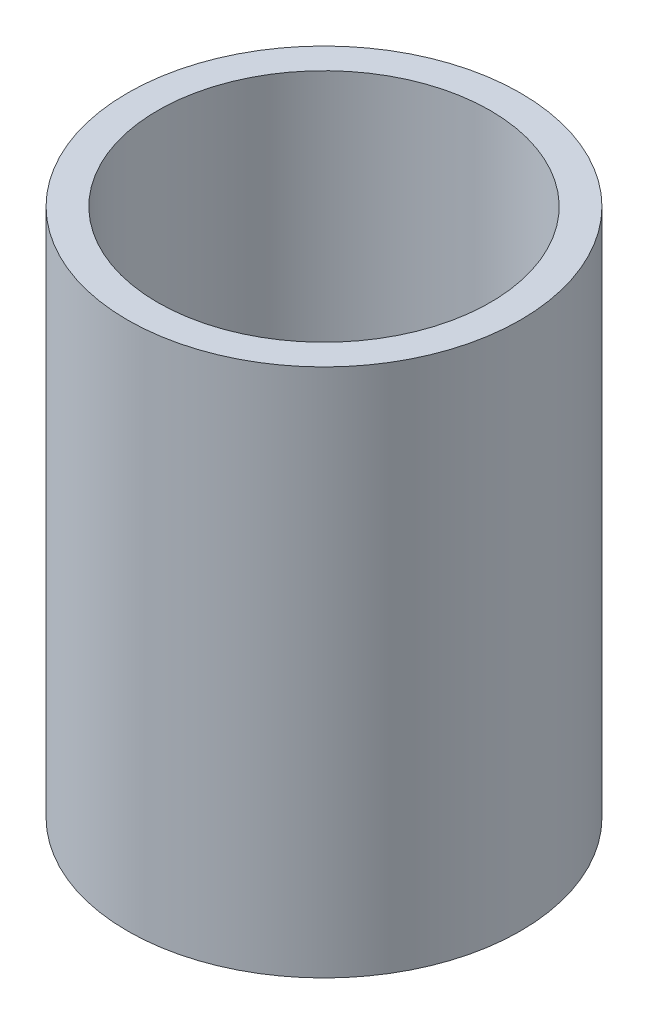
ISO-10303-21;
HEADER;
FILE_DESCRIPTION(('STEP AP214'),'2;1');
FILE_NAME('part.step','',(''),(''),'','','');
FILE_SCHEMA(('AUTOMOTIVE_DESIGN { 1 0 10303 214 1 1 1 1 }'));
ENDSEC;
DATA;
#1=APPLICATION_CONTEXT('core data for automotive mechanical design processes');
#2=APPLICATION_PROTOCOL_DEFINITION('international standard','automotive_design',2000,#1);
#3=PRODUCT_CONTEXT('',#1,'mechanical');
#4=PRODUCT('Part','Part','',(#3));
#5=PRODUCT_RELATED_PRODUCT_CATEGORY('part','',(#4));
#6=PRODUCT_DEFINITION_FORMATION('','',#4);
#7=PRODUCT_DEFINITION_CONTEXT('part definition',#1,'design');
#8=PRODUCT_DEFINITION('design','',#6,#7);
#9=PRODUCT_DEFINITION_SHAPE('','',#8);
#10=(LENGTH_UNIT() NAMED_UNIT(*) SI_UNIT(.MILLI.,.METRE.));
#11=(NAMED_UNIT(*) PLANE_ANGLE_UNIT() SI_UNIT($,.RADIAN.));
#12=(NAMED_UNIT(*) SI_UNIT($,.STERADIAN.) SOLID_ANGLE_UNIT());
#13=UNCERTAINTY_MEASURE_WITH_UNIT(LENGTH_MEASURE(1.E-05),#10,'distance_accuracy_value','');
#14=(GEOMETRIC_REPRESENTATION_CONTEXT(3) GLOBAL_UNCERTAINTY_ASSIGNED_CONTEXT((#13)) GLOBAL_UNIT_ASSIGNED_CONTEXT((#10,
#11,#12)) REPRESENTATION_CONTEXT('',''));
#15=CARTESIAN_POINT('',(0.,0.,0.));
#16=DIRECTION('',(0.,0.,1.));
#17=DIRECTION('',(1.,0.,0.));
#18=AXIS2_PLACEMENT_3D('',#15,#16,#17);
#19=CARTESIAN_POINT('',(0.,140.,0.));
#20=DIRECTION('',(0.,-1.,0.));
#21=DIRECTION('',(0.,0.,-1.));
#22=AXIS2_PLACEMENT_3D('',#19,#20,#21);
#23=CYLINDRICAL_SURFACE('',#22,44.);
#24=CARTESIAN_POINT('',(0.,140.,0.));
#25=DIRECTION('',(0.,1.,0.));
#26=DIRECTION('',(0.,0.,1.));
#27=AXIS2_PLACEMENT_3D('',#24,#25,#26);
#28=CIRCLE('',#27,44.);
#29=CARTESIAN_POINT('',(0.,140.,44.));
#30=VERTEX_POINT('',#29);
#31=EDGE_CURVE('E56',#30,#30,#28,.T.);
#32=ORIENTED_EDGE('',*,*,#31,.T.);
#33=EDGE_LOOP('',(#32));
#34=FACE_BOUND('',#33,.T.);
#35=CARTESIAN_POINT('',(0.,8.00000000000001,0.));
#36=DIRECTION('',(0.,1.,0.));
#37=DIRECTION('',(0.,0.,1.));
#38=AXIS2_PLACEMENT_3D('',#35,#36,#37);
#39=CIRCLE('',#38,44.);
#40=CARTESIAN_POINT('',(0.,8.00000000000001,44.));
#41=VERTEX_POINT('',#40);
#42=EDGE_CURVE('E10',#41,#41,#39,.T.);
#43=ORIENTED_EDGE('',*,*,#42,.F.);
#44=EDGE_LOOP('',(#43));
#45=FACE_BOUND('',#44,.T.);
#46=ADVANCED_FACE('F37',(#34,#45),#23,.F.);
#47=CARTESIAN_POINT('',(0.,8.,0.));
#48=DIRECTION('',(0.,1.,0.));
#49=DIRECTION('',(0.,0.,1.));
#50=AXIS2_PLACEMENT_3D('',#47,#48,#49);
#51=PLANE('',#50);
#52=ORIENTED_EDGE('',*,*,#42,.T.);
#53=EDGE_LOOP('',(#52));
#54=FACE_BOUND('',#53,.T.);
#55=ADVANCED_FACE('F39',(#54),#51,.T.);
#56=CARTESIAN_POINT('',(0.,140.,0.));
#57=DIRECTION('',(0.,-1.,0.));
#58=DIRECTION('',(0.,0.,-1.));
#59=AXIS2_PLACEMENT_3D('',#56,#57,#58);
#60=CYLINDRICAL_SURFACE('',#59,52.);
#61=CARTESIAN_POINT('',(0.,140.,0.));
#62=DIRECTION('',(0.,1.,0.));
#63=DIRECTION('',(0.,0.,1.));
#64=AXIS2_PLACEMENT_3D('',#61,#62,#63);
#65=CIRCLE('',#64,52.);
#66=CARTESIAN_POINT('',(0.,140.,52.));
#67=VERTEX_POINT('',#66);
#68=EDGE_CURVE('E45',#67,#67,#65,.T.);
#69=ORIENTED_EDGE('',*,*,#68,.F.);
#70=EDGE_LOOP('',(#69));
#71=FACE_BOUND('',#70,.T.);
#72=CARTESIAN_POINT('',(0.,0.,0.));
#73=DIRECTION('',(0.,1.,0.));
#74=DIRECTION('',(0.,0.,1.));
#75=AXIS2_PLACEMENT_3D('',#72,#73,#74);
#76=CIRCLE('',#75,52.);
#77=CARTESIAN_POINT('',(0.,0.,52.));
#78=VERTEX_POINT('',#77);
#79=EDGE_CURVE('E50',#78,#78,#76,.T.);
#80=ORIENTED_EDGE('',*,*,#79,.T.);
#81=EDGE_LOOP('',(#80));
#82=FACE_BOUND('',#81,.T.);
#83=ADVANCED_FACE('F67',(#71,#82),#60,.T.);
#84=CARTESIAN_POINT('',(0.,140.,0.));
#85=DIRECTION('',(0.,1.,0.));
#86=DIRECTION('',(0.,0.,1.));
#87=AXIS2_PLACEMENT_3D('',#84,#85,#86);
#88=PLANE('',#87);
#89=ORIENTED_EDGE('',*,*,#31,.F.);
#90=EDGE_LOOP('',(#89));
#91=FACE_BOUND('',#90,.T.);
#92=ORIENTED_EDGE('',*,*,#68,.T.);
#93=EDGE_LOOP('',(#92));
#94=FACE_BOUND('',#93,.T.);
#95=ADVANCED_FACE('F64',(#91,#94),#88,.T.);
#96=CARTESIAN_POINT('',(0.,0.,0.));
#97=DIRECTION('',(0.,1.,0.));
#98=DIRECTION('',(0.,0.,1.));
#99=AXIS2_PLACEMENT_3D('',#96,#97,#98);
#100=PLANE('',#99);
#101=ORIENTED_EDGE('',*,*,#79,.F.);
#102=EDGE_LOOP('',(#101));
#103=FACE_BOUND('',#102,.T.);
#104=ADVANCED_FACE('F66',(#103),#100,.F.);
#105=CLOSED_SHELL('',(#46,#55,#83,#95,#104));
#106=MANIFOLD_SOLID_BREP('B2',#105);
#107=ADVANCED_BREP_SHAPE_REPRESENTATION('',(#18,#106),#14);
#108=SHAPE_DEFINITION_REPRESENTATION(#9,#107);
ENDSEC;
END-ISO-10303-21;
